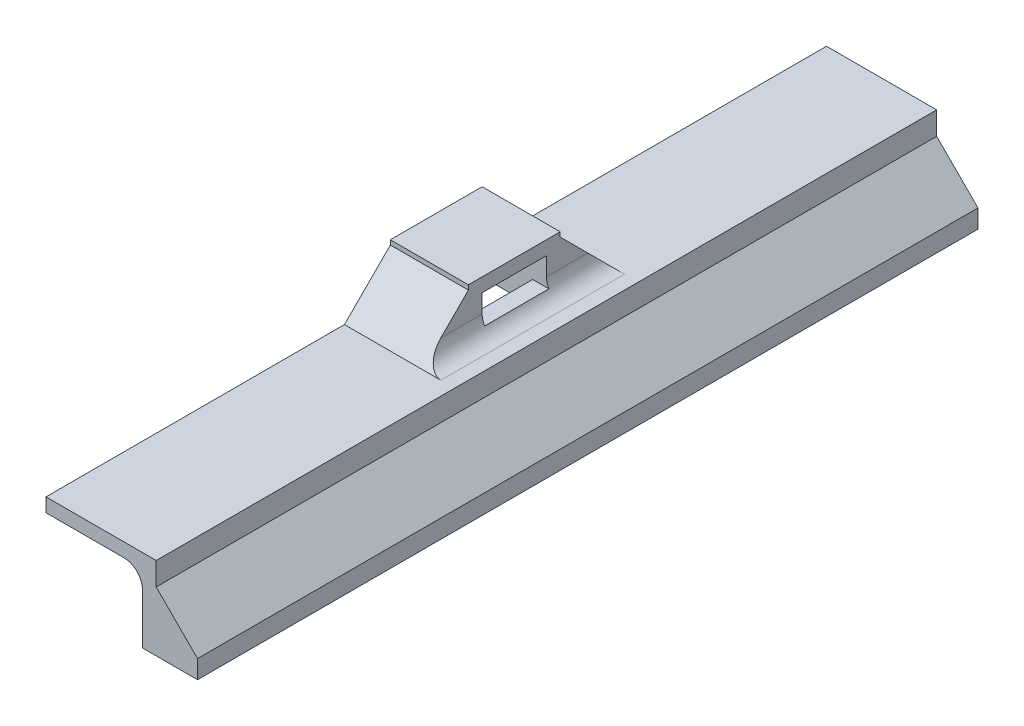
ISO-10303-21;
HEADER;
FILE_DESCRIPTION(('STEP AP214'),'2;1');
FILE_NAME('part.step','',(''),(''),'','','');
FILE_SCHEMA(('AUTOMOTIVE_DESIGN { 1 0 10303 214 1 1 1 1 }'));
ENDSEC;
DATA;
#1=APPLICATION_CONTEXT('core data for automotive mechanical design processes');
#2=APPLICATION_PROTOCOL_DEFINITION('international standard','automotive_design',2000,#1);
#3=PRODUCT_CONTEXT('',#1,'mechanical');
#4=PRODUCT('Part','Part','',(#3));
#5=PRODUCT_RELATED_PRODUCT_CATEGORY('part','',(#4));
#6=PRODUCT_DEFINITION_FORMATION('','',#4);
#7=PRODUCT_DEFINITION_CONTEXT('part definition',#1,'design');
#8=PRODUCT_DEFINITION('design','',#6,#7);
#9=PRODUCT_DEFINITION_SHAPE('','',#8);
#10=(LENGTH_UNIT() NAMED_UNIT(*) SI_UNIT(.MILLI.,.METRE.));
#11=(NAMED_UNIT(*) PLANE_ANGLE_UNIT() SI_UNIT($,.RADIAN.));
#12=(NAMED_UNIT(*) SI_UNIT($,.STERADIAN.) SOLID_ANGLE_UNIT());
#13=UNCERTAINTY_MEASURE_WITH_UNIT(LENGTH_MEASURE(1.E-05),#10,'distance_accuracy_value','');
#14=(GEOMETRIC_REPRESENTATION_CONTEXT(3) GLOBAL_UNCERTAINTY_ASSIGNED_CONTEXT((#13)) GLOBAL_UNIT_ASSIGNED_CONTEXT((#10,
#11,#12)) REPRESENTATION_CONTEXT('',''));
#15=CARTESIAN_POINT('',(0.,0.,0.));
#16=DIRECTION('',(0.,0.,1.));
#17=DIRECTION('',(1.,0.,0.));
#18=AXIS2_PLACEMENT_3D('',#15,#16,#17);
#19=CARTESIAN_POINT('',(-3.,1.5,42.5));
#20=DIRECTION('',(1.,0.,0.));
#21=DIRECTION('',(0.,0.,-1.));
#22=AXIS2_PLACEMENT_3D('',#19,#20,#21);
#23=PLANE('',#22);
#24=DIRECTION('',(0.,-1.,0.));
#25=VECTOR('',#24,1.);
#26=CARTESIAN_POINT('',(-3.,1.5,42.5));
#27=LINE('',#26,#25);
#28=CARTESIAN_POINT('',(-3.,5.5,42.5));
#29=VERTEX_POINT('',#28);
#30=CARTESIAN_POINT('',(-3.,0.,42.5));
#31=VERTEX_POINT('',#30);
#32=EDGE_CURVE('E290',#29,#31,#27,.T.);
#33=ORIENTED_EDGE('',*,*,#32,.F.);
#34=DIRECTION('',(0.,0.,1.));
#35=VECTOR('',#34,1.);
#36=CARTESIAN_POINT('',(-3.,5.5,-42.5));
#37=LINE('',#36,#35);
#38=CARTESIAN_POINT('',(-3.,5.5,-42.5));
#39=VERTEX_POINT('',#38);
#40=EDGE_CURVE('E52',#29,#39,#37,.F.);
#41=ORIENTED_EDGE('',*,*,#40,.T.);
#42=DIRECTION('',(0.,-1.,0.));
#43=VECTOR('',#42,1.);
#44=CARTESIAN_POINT('',(-3.,1.5,-42.5));
#45=LINE('',#44,#43);
#46=CARTESIAN_POINT('',(-3.,0.,-42.5));
#47=VERTEX_POINT('',#46);
#48=EDGE_CURVE('E372',#39,#47,#45,.T.);
#49=ORIENTED_EDGE('',*,*,#48,.T.);
#50=DIRECTION('',(0.,0.,1.));
#51=VECTOR('',#50,1.);
#52=CARTESIAN_POINT('',(-3.,0.,42.5));
#53=LINE('',#52,#51);
#54=EDGE_CURVE('E361',#47,#31,#53,.T.);
#55=ORIENTED_EDGE('',*,*,#54,.T.);
#56=EDGE_LOOP('',(#33,#41,#49,#55));
#57=FACE_BOUND('',#56,.T.);
#58=ADVANCED_FACE('F37',(#57),#23,.F.);
#59=CARTESIAN_POINT('',(3.,1.5,42.5));
#60=DIRECTION('',(0.,0.,-1.));
#61=DIRECTION('',(-1.,0.,0.));
#62=AXIS2_PLACEMENT_3D('',#59,#60,#61);
#63=PLANE('',#62);
#64=DIRECTION('',(1.,0.,0.));
#65=VECTOR('',#64,1.);
#66=CARTESIAN_POINT('',(3.,0.,42.5));
#67=LINE('',#66,#65);
#68=CARTESIAN_POINT('',(3.,0.,42.5));
#69=VERTEX_POINT('',#68);
#70=EDGE_CURVE('E364',#31,#69,#67,.T.);
#71=ORIENTED_EDGE('',*,*,#70,.T.);
#72=DIRECTION('',(0.,-1.,0.));
#73=VECTOR('',#72,1.);
#74=CARTESIAN_POINT('',(3.,1.5,42.5));
#75=LINE('',#74,#73);
#76=CARTESIAN_POINT('',(3.,2.00000000000004,42.5));
#77=VERTEX_POINT('',#76);
#78=EDGE_CURVE('E376',#77,#69,#75,.T.);
#79=ORIENTED_EDGE('',*,*,#78,.F.);
#80=DIRECTION('',(-0.707106781186544,0.707106781186551,0.));
#81=VECTOR('',#80,1.);
#82=CARTESIAN_POINT('',(3.25000000000002,1.75000000000002,42.5));
#83=LINE('',#82,#81);
#84=CARTESIAN_POINT('',(-1.5,6.50000000000009,42.5));
#85=VERTEX_POINT('',#84);
#86=EDGE_CURVE('E296',#77,#85,#83,.T.);
#87=ORIENTED_EDGE('',*,*,#86,.T.);
#88=DIRECTION('',(0.,-1.,0.));
#89=VECTOR('',#88,1.);
#90=CARTESIAN_POINT('',(-1.5,7.5,42.5));
#91=LINE('',#90,#89);
#92=CARTESIAN_POINT('',(-1.5,9.,42.5));
#93=VERTEX_POINT('',#92);
#94=EDGE_CURVE('E365',#93,#85,#91,.T.);
#95=ORIENTED_EDGE('',*,*,#94,.F.);
#96=DIRECTION('',(1.,0.,0.));
#97=VECTOR('',#96,1.);
#98=CARTESIAN_POINT('',(-1.5,9.,42.5));
#99=LINE('',#98,#97);
#100=CARTESIAN_POINT('',(-13.5,9.,42.5));
#101=VERTEX_POINT('',#100);
#102=EDGE_CURVE('E303',#101,#93,#99,.T.);
#103=ORIENTED_EDGE('',*,*,#102,.F.);
#104=DIRECTION('',(0.,-1.,0.));
#105=VECTOR('',#104,1.);
#106=CARTESIAN_POINT('',(-13.5,9.,42.5));
#107=LINE('',#106,#105);
#108=CARTESIAN_POINT('',(-13.5,7.5,42.5));
#109=VERTEX_POINT('',#108);
#110=EDGE_CURVE('E279',#101,#109,#107,.T.);
#111=ORIENTED_EDGE('',*,*,#110,.T.);
#112=DIRECTION('',(1.,0.,0.));
#113=VECTOR('',#112,1.);
#114=CARTESIAN_POINT('',(-1.5,7.5,42.5));
#115=LINE('',#114,#113);
#116=CARTESIAN_POINT('',(-5.,7.5,42.5));
#117=VERTEX_POINT('',#116);
#118=EDGE_CURVE('E251',#109,#117,#115,.T.);
#119=ORIENTED_EDGE('',*,*,#118,.T.);
#120=CARTESIAN_POINT('',(-5.,5.5,42.5));
#121=DIRECTION('',(0.,0.,-1.));
#122=DIRECTION('',(-1.,0.,0.));
#123=AXIS2_PLACEMENT_3D('',#120,#121,#122);
#124=CIRCLE('',#123,2.);
#125=EDGE_CURVE('E45',#117,#29,#124,.T.);
#126=ORIENTED_EDGE('',*,*,#125,.T.);
#127=ORIENTED_EDGE('',*,*,#32,.T.);
#128=EDGE_LOOP('',(#71,#79,#87,#95,#103,#111,#119,#126,#127));
#129=FACE_BOUND('',#128,.T.);
#130=ADVANCED_FACE('F401',(#129),#63,.F.);
#131=CARTESIAN_POINT('',(3.,1.5,42.5));
#132=DIRECTION('',(-1.,0.,0.));
#133=DIRECTION('',(0.,0.,1.));
#134=AXIS2_PLACEMENT_3D('',#131,#132,#133);
#135=PLANE('',#134);
#136=DIRECTION('',(0.,0.,-1.));
#137=VECTOR('',#136,1.);
#138=CARTESIAN_POINT('',(3.,0.,42.5));
#139=LINE('',#138,#137);
#140=CARTESIAN_POINT('',(3.,0.,-42.5));
#141=VERTEX_POINT('',#140);
#142=EDGE_CURVE('E367',#69,#141,#139,.T.);
#143=ORIENTED_EDGE('',*,*,#142,.T.);
#144=DIRECTION('',(0.,-1.,0.));
#145=VECTOR('',#144,1.);
#146=CARTESIAN_POINT('',(3.,1.5,-42.5));
#147=LINE('',#146,#145);
#148=CARTESIAN_POINT('',(3.,2.00000000000004,-42.5));
#149=VERTEX_POINT('',#148);
#150=EDGE_CURVE('E373',#149,#141,#147,.T.);
#151=ORIENTED_EDGE('',*,*,#150,.F.);
#152=DIRECTION('',(0.,0.,1.));
#153=VECTOR('',#152,1.);
#154=CARTESIAN_POINT('',(3.,2.00000000000004,42.5));
#155=LINE('',#154,#153);
#156=EDGE_CURVE('E293',#149,#77,#155,.T.);
#157=ORIENTED_EDGE('',*,*,#156,.T.);
#158=ORIENTED_EDGE('',*,*,#78,.T.);
#159=EDGE_LOOP('',(#143,#151,#157,#158));
#160=FACE_BOUND('',#159,.T.);
#161=ADVANCED_FACE('F462',(#160),#135,.F.);
#162=CARTESIAN_POINT('',(3.,1.5,-42.5));
#163=DIRECTION('',(0.,0.,1.));
#164=DIRECTION('',(1.,0.,0.));
#165=AXIS2_PLACEMENT_3D('',#162,#163,#164);
#166=PLANE('',#165);
#167=DIRECTION('',(-1.,0.,0.));
#168=VECTOR('',#167,1.);
#169=CARTESIAN_POINT('',(3.,0.,-42.5));
#170=LINE('',#169,#168);
#171=EDGE_CURVE('E369',#141,#47,#170,.T.);
#172=ORIENTED_EDGE('',*,*,#171,.T.);
#173=ORIENTED_EDGE('',*,*,#48,.F.);
#174=CARTESIAN_POINT('',(-5.,5.5,-42.5));
#175=DIRECTION('',(0.,0.,1.));
#176=DIRECTION('',(1.,0.,0.));
#177=AXIS2_PLACEMENT_3D('',#174,#175,#176);
#178=CIRCLE('',#177,2.);
#179=CARTESIAN_POINT('',(-5.,7.5,-42.5));
#180=VERTEX_POINT('',#179);
#181=EDGE_CURVE('E11',#39,#180,#178,.T.);
#182=ORIENTED_EDGE('',*,*,#181,.T.);
#183=DIRECTION('',(-1.,0.,0.));
#184=VECTOR('',#183,1.);
#185=CARTESIAN_POINT('',(-1.5,7.5,-42.5));
#186=LINE('',#185,#184);
#187=CARTESIAN_POINT('',(-13.5,7.5,-42.5));
#188=VERTEX_POINT('',#187);
#189=EDGE_CURVE('E245',#180,#188,#186,.T.);
#190=ORIENTED_EDGE('',*,*,#189,.T.);
#191=DIRECTION('',(0.,-1.,0.));
#192=VECTOR('',#191,1.);
#193=CARTESIAN_POINT('',(-13.5,9.,-42.5));
#194=LINE('',#193,#192);
#195=CARTESIAN_POINT('',(-13.5,9.,-42.5));
#196=VERTEX_POINT('',#195);
#197=EDGE_CURVE('E271',#196,#188,#194,.T.);
#198=ORIENTED_EDGE('',*,*,#197,.F.);
#199=DIRECTION('',(-1.,0.,0.));
#200=VECTOR('',#199,1.);
#201=CARTESIAN_POINT('',(-1.5,9.,-42.5));
#202=LINE('',#201,#200);
#203=CARTESIAN_POINT('',(-1.5,9.,-42.5));
#204=VERTEX_POINT('',#203);
#205=EDGE_CURVE('E250',#204,#196,#202,.T.);
#206=ORIENTED_EDGE('',*,*,#205,.F.);
#207=DIRECTION('',(0.,-1.,0.));
#208=VECTOR('',#207,1.);
#209=CARTESIAN_POINT('',(-1.5,7.5,-42.5));
#210=LINE('',#209,#208);
#211=CARTESIAN_POINT('',(-1.5,6.50000000000009,-42.5));
#212=VERTEX_POINT('',#211);
#213=EDGE_CURVE('E379',#204,#212,#210,.T.);
#214=ORIENTED_EDGE('',*,*,#213,.T.);
#215=DIRECTION('',(0.707106781186544,-0.707106781186551,0.));
#216=VECTOR('',#215,1.);
#217=CARTESIAN_POINT('',(3.25000000000002,1.75000000000002,-42.5));
#218=LINE('',#217,#216);
#219=EDGE_CURVE('E289',#212,#149,#218,.T.);
#220=ORIENTED_EDGE('',*,*,#219,.T.);
#221=ORIENTED_EDGE('',*,*,#150,.T.);
#222=EDGE_LOOP('',(#172,#173,#182,#190,#198,#206,#214,#220,#221));
#223=FACE_BOUND('',#222,.T.);
#224=ADVANCED_FACE('F416',(#223),#166,.F.);
#225=CARTESIAN_POINT('',(0.,0.,0.));
#226=DIRECTION('',(0.,1.,0.));
#227=DIRECTION('',(0.,0.,1.));
#228=AXIS2_PLACEMENT_3D('',#225,#226,#227);
#229=PLANE('',#228);
#230=ORIENTED_EDGE('',*,*,#54,.F.);
#231=ORIENTED_EDGE('',*,*,#171,.F.);
#232=ORIENTED_EDGE('',*,*,#142,.F.);
#233=ORIENTED_EDGE('',*,*,#70,.F.);
#234=EDGE_LOOP('',(#230,#231,#232,#233));
#235=FACE_BOUND('',#234,.T.);
#236=ADVANCED_FACE('F484',(#235),#229,.F.);
#237=CARTESIAN_POINT('',(-1.5,7.5,42.5));
#238=DIRECTION('',(-1.,0.,0.));
#239=DIRECTION('',(0.,0.,1.));
#240=AXIS2_PLACEMENT_3D('',#237,#238,#239);
#241=PLANE('',#240);
#242=ORIENTED_EDGE('',*,*,#94,.T.);
#243=DIRECTION('',(0.,0.,-1.));
#244=VECTOR('',#243,1.);
#245=CARTESIAN_POINT('',(-1.5,6.50000000000009,42.5));
#246=LINE('',#245,#244);
#247=EDGE_CURVE('E286',#85,#212,#246,.T.);
#248=ORIENTED_EDGE('',*,*,#247,.T.);
#249=ORIENTED_EDGE('',*,*,#213,.F.);
#250=DIRECTION('',(0.,0.,-1.));
#251=VECTOR('',#250,1.);
#252=CARTESIAN_POINT('',(-1.5,9.,42.5));
#253=LINE('',#252,#251);
#254=EDGE_CURVE('E247',#93,#204,#253,.T.);
#255=ORIENTED_EDGE('',*,*,#254,.F.);
#256=EDGE_LOOP('',(#242,#248,#249,#255));
#257=FACE_BOUND('',#256,.T.);
#258=ADVANCED_FACE('F411',(#257),#241,.F.);
#259=CARTESIAN_POINT('',(0.,7.5,0.));
#260=DIRECTION('',(0.,1.,0.));
#261=DIRECTION('',(0.,0.,1.));
#262=AXIS2_PLACEMENT_3D('',#259,#260,#261);
#263=PLANE('',#262);
#264=ORIENTED_EDGE('',*,*,#189,.F.);
#265=DIRECTION('',(0.,0.,1.));
#266=VECTOR('',#265,1.);
#267=CARTESIAN_POINT('',(-5.,7.5,42.5));
#268=LINE('',#267,#266);
#269=EDGE_CURVE('E336',#180,#117,#268,.T.);
#270=ORIENTED_EDGE('',*,*,#269,.T.);
#271=ORIENTED_EDGE('',*,*,#118,.F.);
#272=DIRECTION('',(0.,0.,1.));
#273=VECTOR('',#272,1.);
#274=CARTESIAN_POINT('',(-13.5,7.5,42.5));
#275=LINE('',#274,#273);
#276=CARTESIAN_POINT('',(-13.5,7.5,3.50000000000001));
#277=VERTEX_POINT('',#276);
#278=EDGE_CURVE('E352',#277,#109,#275,.T.);
#279=ORIENTED_EDGE('',*,*,#278,.F.);
#280=DIRECTION('',(-1.,0.,0.));
#281=VECTOR('',#280,1.);
#282=CARTESIAN_POINT('',(-13.5,7.5,3.50000000000001));
#283=LINE('',#282,#281);
#284=CARTESIAN_POINT('',(-6.50000000000001,7.5,3.50000000000001));
#285=VERTEX_POINT('',#284);
#286=EDGE_CURVE('E350',#285,#277,#283,.T.);
#287=ORIENTED_EDGE('',*,*,#286,.F.);
#288=DIRECTION('',(0.,0.,1.));
#289=VECTOR('',#288,1.);
#290=CARTESIAN_POINT('',(-6.50000000000001,7.5,-3.49999999999999));
#291=LINE('',#290,#289);
#292=CARTESIAN_POINT('',(-6.50000000000001,7.5,-3.49999999999999));
#293=VERTEX_POINT('',#292);
#294=EDGE_CURVE('E347',#293,#285,#291,.T.);
#295=ORIENTED_EDGE('',*,*,#294,.F.);
#296=DIRECTION('',(1.,0.,0.));
#297=VECTOR('',#296,1.);
#298=CARTESIAN_POINT('',(-13.5,7.5,-3.49999999999999));
#299=LINE('',#298,#297);
#300=CARTESIAN_POINT('',(-13.5,7.5,-3.49999999999999));
#301=VERTEX_POINT('',#300);
#302=EDGE_CURVE('E344',#301,#293,#299,.T.);
#303=ORIENTED_EDGE('',*,*,#302,.F.);
#304=DIRECTION('',(0.,0.,1.));
#305=VECTOR('',#304,1.);
#306=CARTESIAN_POINT('',(-13.5,7.5,-3.49999999999999));
#307=LINE('',#306,#305);
#308=EDGE_CURVE('E339',#188,#301,#307,.T.);
#309=ORIENTED_EDGE('',*,*,#308,.F.);
#310=EDGE_LOOP('',(#264,#270,#271,#279,#287,#295,#303,#309));
#311=FACE_BOUND('',#310,.T.);
#312=ADVANCED_FACE('F395',(#311),#263,.F.);
#313=CARTESIAN_POINT('',(-13.5,9.,-3.49999999999999));
#314=DIRECTION('',(1.,0.,0.));
#315=DIRECTION('',(0.,0.,-1.));
#316=AXIS2_PLACEMENT_3D('',#313,#314,#315);
#317=PLANE('',#316);
#318=DIRECTION('',(0.,0.,-1.));
#319=VECTOR('',#318,1.);
#320=CARTESIAN_POINT('',(-13.5,13.,3.50000000000001));
#321=LINE('',#320,#319);
#322=CARTESIAN_POINT('',(-13.5,13.,3.50000000000001));
#323=VERTEX_POINT('',#322);
#324=CARTESIAN_POINT('',(-13.5,13.,-3.49999999999999));
#325=VERTEX_POINT('',#324);
#326=EDGE_CURVE('E210',#323,#325,#321,.T.);
#327=ORIENTED_EDGE('',*,*,#326,.F.);
#328=DIRECTION('',(0.,-1.,0.));
#329=VECTOR('',#328,1.);
#330=CARTESIAN_POINT('',(-13.5,9.,3.50000000000001));
#331=LINE('',#330,#329);
#332=EDGE_CURVE('E275',#323,#277,#331,.T.);
#333=ORIENTED_EDGE('',*,*,#332,.T.);
#334=ORIENTED_EDGE('',*,*,#278,.T.);
#335=ORIENTED_EDGE('',*,*,#110,.F.);
#336=DIRECTION('',(0.,0.,1.));
#337=VECTOR('',#336,1.);
#338=CARTESIAN_POINT('',(-13.5,9.,42.5));
#339=LINE('',#338,#337);
#340=CARTESIAN_POINT('',(-13.5,9.,9.99999999999998));
#341=VERTEX_POINT('',#340);
#342=EDGE_CURVE('E262',#341,#101,#339,.T.);
#343=ORIENTED_EDGE('',*,*,#342,.F.);
#344=DIRECTION('',(0.,0.707106781186551,-0.707106781186544));
#345=VECTOR('',#344,1.);
#346=CARTESIAN_POINT('',(-13.5,15.75,3.25000000000006));
#347=LINE('',#346,#345);
#348=CARTESIAN_POINT('',(-13.5,14.,5.));
#349=VERTEX_POINT('',#348);
#350=EDGE_CURVE('E311',#341,#349,#347,.T.);
#351=ORIENTED_EDGE('',*,*,#350,.T.);
#352=DIRECTION('',(0.,-1.,0.));
#353=VECTOR('',#352,1.);
#354=CARTESIAN_POINT('',(-13.5,14.5,5.));
#355=LINE('',#354,#353);
#356=CARTESIAN_POINT('',(-13.5,14.5,5.));
#357=VERTEX_POINT('',#356);
#358=EDGE_CURVE('E241',#357,#349,#355,.T.);
#359=ORIENTED_EDGE('',*,*,#358,.F.);
#360=DIRECTION('',(0.,0.,1.));
#361=VECTOR('',#360,1.);
#362=CARTESIAN_POINT('',(-13.5,14.5,0.));
#363=LINE('',#362,#361);
#364=CARTESIAN_POINT('',(-13.5,14.5,-5.));
#365=VERTEX_POINT('',#364);
#366=EDGE_CURVE('E234',#365,#357,#363,.T.);
#367=ORIENTED_EDGE('',*,*,#366,.F.);
#368=DIRECTION('',(0.,-1.,0.));
#369=VECTOR('',#368,1.);
#370=CARTESIAN_POINT('',(-13.5,14.5,-5.));
#371=LINE('',#370,#369);
#372=CARTESIAN_POINT('',(-13.5,14.,-5.));
#373=VERTEX_POINT('',#372);
#374=EDGE_CURVE('E246',#365,#373,#371,.T.);
#375=ORIENTED_EDGE('',*,*,#374,.T.);
#376=DIRECTION('',(0.,0.707106781186544,0.707106781186551));
#377=VECTOR('',#376,1.);
#378=CARTESIAN_POINT('',(-13.5,12.25,-6.74999999999998));
#379=LINE('',#378,#377);
#380=CARTESIAN_POINT('',(-13.5,9.,-10.));
#381=VERTEX_POINT('',#380);
#382=EDGE_CURVE('E315',#373,#381,#379,.F.);
#383=ORIENTED_EDGE('',*,*,#382,.T.);
#384=DIRECTION('',(0.,0.,1.));
#385=VECTOR('',#384,1.);
#386=CARTESIAN_POINT('',(-13.5,9.,-3.49999999999999));
#387=LINE('',#386,#385);
#388=EDGE_CURVE('E253',#196,#381,#387,.T.);
#389=ORIENTED_EDGE('',*,*,#388,.F.);
#390=ORIENTED_EDGE('',*,*,#197,.T.);
#391=ORIENTED_EDGE('',*,*,#308,.T.);
#392=DIRECTION('',(0.,-1.,0.));
#393=VECTOR('',#392,1.);
#394=CARTESIAN_POINT('',(-13.5,9.,-3.49999999999999));
#395=LINE('',#394,#393);
#396=EDGE_CURVE('E269',#325,#301,#395,.T.);
#397=ORIENTED_EDGE('',*,*,#396,.F.);
#398=EDGE_LOOP('',(#327,#333,#334,#335,#343,#351,#359,#367,#375,#383,#389,#390,#391,#397));
#399=FACE_BOUND('',#398,.T.);
#400=ADVANCED_FACE('F434',(#399),#317,.F.);
#401=CARTESIAN_POINT('',(-13.5,9.,-3.49999999999999));
#402=DIRECTION('',(0.,0.,-1.));
#403=DIRECTION('',(-1.,0.,0.));
#404=AXIS2_PLACEMENT_3D('',#401,#402,#403);
#405=PLANE('',#404);
#406=DIRECTION('',(0.,-1.,0.));
#407=VECTOR('',#406,1.);
#408=CARTESIAN_POINT('',(-6.50000000000001,9.,-3.49999999999999));
#409=LINE('',#408,#407);
#410=CARTESIAN_POINT('',(-6.50000000000001,10.,-3.49999999999999));
#411=VERTEX_POINT('',#410);
#412=EDGE_CURVE('E272',#411,#293,#409,.T.);
#413=ORIENTED_EDGE('',*,*,#412,.F.);
#414=DIRECTION('',(1.,0.,0.));
#415=VECTOR('',#414,1.);
#416=CARTESIAN_POINT('',(-9.00000000000001,10.,-3.5));
#417=LINE('',#416,#415);
#418=CARTESIAN_POINT('',(-4.73205080756889,10.,-3.5));
#419=VERTEX_POINT('',#418);
#420=EDGE_CURVE('E218',#411,#419,#417,.T.);
#421=ORIENTED_EDGE('',*,*,#420,.T.);
#422=CARTESIAN_POINT('',(-3.00000000000001,11.,-3.49999999999999));
#423=DIRECTION('',(0.,0.,-1.));
#424=DIRECTION('',(-1.,0.,0.));
#425=AXIS2_PLACEMENT_3D('',#422,#423,#424);
#426=CIRCLE('',#425,2.);
#427=CARTESIAN_POINT('',(-5.00000000000001,11.,-3.5));
#428=VERTEX_POINT('',#427);
#429=EDGE_CURVE('E198',#419,#428,#426,.T.);
#430=ORIENTED_EDGE('',*,*,#429,.T.);
#431=DIRECTION('',(0.,1.,0.));
#432=VECTOR('',#431,1.);
#433=CARTESIAN_POINT('',(-5.00000000000001,10.,-3.5));
#434=LINE('',#433,#432);
#435=CARTESIAN_POINT('',(-5.00000000000001,13.,-3.5));
#436=VERTEX_POINT('',#435);
#437=EDGE_CURVE('E190',#428,#436,#434,.T.);
#438=ORIENTED_EDGE('',*,*,#437,.T.);
#439=DIRECTION('',(1.,0.,0.));
#440=VECTOR('',#439,1.);
#441=CARTESIAN_POINT('',(-13.5,13.,-3.49999999999999));
#442=LINE('',#441,#440);
#443=EDGE_CURVE('E195',#325,#436,#442,.T.);
#444=ORIENTED_EDGE('',*,*,#443,.F.);
#445=ORIENTED_EDGE('',*,*,#396,.T.);
#446=ORIENTED_EDGE('',*,*,#302,.T.);
#447=EDGE_LOOP('',(#413,#421,#430,#438,#444,#445,#446));
#448=FACE_BOUND('',#447,.T.);
#449=ADVANCED_FACE('F193',(#448),#405,.F.);
#450=CARTESIAN_POINT('',(-6.50000000000001,9.,-3.49999999999999));
#451=DIRECTION('',(1.,0.,0.));
#452=DIRECTION('',(0.,0.,-1.));
#453=AXIS2_PLACEMENT_3D('',#450,#451,#452);
#454=PLANE('',#453);
#455=DIRECTION('',(0.,-1.,0.));
#456=VECTOR('',#455,1.);
#457=CARTESIAN_POINT('',(-6.50000000000001,9.,3.50000000000001));
#458=LINE('',#457,#456);
#459=CARTESIAN_POINT('',(-6.50000000000001,10.,3.5));
#460=VERTEX_POINT('',#459);
#461=EDGE_CURVE('E278',#460,#285,#458,.T.);
#462=ORIENTED_EDGE('',*,*,#461,.F.);
#463=DIRECTION('',(0.,0.,-1.));
#464=VECTOR('',#463,1.);
#465=CARTESIAN_POINT('',(-6.50000000000001,10.,-3.49999999999999));
#466=LINE('',#465,#464);
#467=EDGE_CURVE('E222',#460,#411,#466,.T.);
#468=ORIENTED_EDGE('',*,*,#467,.T.);
#469=ORIENTED_EDGE('',*,*,#412,.T.);
#470=ORIENTED_EDGE('',*,*,#294,.T.);
#471=EDGE_LOOP('',(#462,#468,#469,#470));
#472=FACE_BOUND('',#471,.T.);
#473=ADVANCED_FACE('F503',(#472),#454,.F.);
#474=CARTESIAN_POINT('',(-13.5,9.,3.50000000000001));
#475=DIRECTION('',(0.,0.,1.));
#476=DIRECTION('',(1.,0.,0.));
#477=AXIS2_PLACEMENT_3D('',#474,#475,#476);
#478=PLANE('',#477);
#479=DIRECTION('',(-1.,0.,0.));
#480=VECTOR('',#479,1.);
#481=CARTESIAN_POINT('',(-13.5,13.,3.50000000000001));
#482=LINE('',#481,#480);
#483=CARTESIAN_POINT('',(-5.00000000000001,13.,3.5));
#484=VERTEX_POINT('',#483);
#485=EDGE_CURVE('E211',#484,#323,#482,.T.);
#486=ORIENTED_EDGE('',*,*,#485,.F.);
#487=DIRECTION('',(0.,-1.,0.));
#488=VECTOR('',#487,1.);
#489=CARTESIAN_POINT('',(-5.00000000000001,10.,3.5));
#490=LINE('',#489,#488);
#491=CARTESIAN_POINT('',(-5.00000000000001,11.,3.5));
#492=VERTEX_POINT('',#491);
#493=EDGE_CURVE('E203',#484,#492,#490,.T.);
#494=ORIENTED_EDGE('',*,*,#493,.T.);
#495=CARTESIAN_POINT('',(-3.00000000000001,11.,3.50000000000001));
#496=DIRECTION('',(0.,0.,1.));
#497=DIRECTION('',(1.,0.,0.));
#498=AXIS2_PLACEMENT_3D('',#495,#496,#497);
#499=CIRCLE('',#498,2.);
#500=CARTESIAN_POINT('',(-4.73205080756889,10.,3.5));
#501=VERTEX_POINT('',#500);
#502=EDGE_CURVE('E326',#492,#501,#499,.T.);
#503=ORIENTED_EDGE('',*,*,#502,.T.);
#504=DIRECTION('',(1.,0.,0.));
#505=VECTOR('',#504,1.);
#506=CARTESIAN_POINT('',(-9.00000000000001,10.,3.5));
#507=LINE('',#506,#505);
#508=EDGE_CURVE('E216',#460,#501,#507,.T.);
#509=ORIENTED_EDGE('',*,*,#508,.F.);
#510=ORIENTED_EDGE('',*,*,#461,.T.);
#511=ORIENTED_EDGE('',*,*,#286,.T.);
#512=ORIENTED_EDGE('',*,*,#332,.F.);
#513=EDGE_LOOP('',(#486,#494,#503,#509,#510,#511,#512));
#514=FACE_BOUND('',#513,.T.);
#515=ADVANCED_FACE('F506',(#514),#478,.F.);
#516=CARTESIAN_POINT('',(0.,9.,0.));
#517=DIRECTION('',(0.,1.,0.));
#518=DIRECTION('',(0.,0.,1.));
#519=AXIS2_PLACEMENT_3D('',#516,#517,#518);
#520=PLANE('',#519);
#521=DIRECTION('',(0.,0.,1.));
#522=VECTOR('',#521,1.);
#523=CARTESIAN_POINT('',(-3.00000000000001,9.,9.99999999999998));
#524=LINE('',#523,#522);
#525=CARTESIAN_POINT('',(-3.00000000000001,9.,-10.));
#526=VERTEX_POINT('',#525);
#527=CARTESIAN_POINT('',(-3.00000000000001,9.,9.99999999999998));
#528=VERTEX_POINT('',#527);
#529=EDGE_CURVE('E317',#526,#528,#524,.T.);
#530=ORIENTED_EDGE('',*,*,#529,.T.);
#531=DIRECTION('',(-1.,0.,0.));
#532=VECTOR('',#531,1.);
#533=CARTESIAN_POINT('',(0.,9.,9.99999999999998));
#534=LINE('',#533,#532);
#535=EDGE_CURVE('E305',#528,#341,#534,.T.);
#536=ORIENTED_EDGE('',*,*,#535,.T.);
#537=ORIENTED_EDGE('',*,*,#342,.T.);
#538=ORIENTED_EDGE('',*,*,#102,.T.);
#539=ORIENTED_EDGE('',*,*,#254,.T.);
#540=ORIENTED_EDGE('',*,*,#205,.T.);
#541=ORIENTED_EDGE('',*,*,#388,.T.);
#542=DIRECTION('',(1.,0.,0.));
#543=VECTOR('',#542,1.);
#544=CARTESIAN_POINT('',(-5.00000000000001,9.,-10.));
#545=LINE('',#544,#543);
#546=EDGE_CURVE('E301',#381,#526,#545,.T.);
#547=ORIENTED_EDGE('',*,*,#546,.T.);
#548=EDGE_LOOP('',(#530,#536,#537,#538,#539,#540,#541,#547));
#549=FACE_BOUND('',#548,.T.);
#550=ADVANCED_FACE('F409',(#549),#520,.T.);
#551=CARTESIAN_POINT('',(-5.00000000000001,14.5,0.));
#552=DIRECTION('',(1.,0.,0.));
#553=DIRECTION('',(0.,0.,-1.));
#554=AXIS2_PLACEMENT_3D('',#551,#552,#553);
#555=PLANE('',#554);
#556=DIRECTION('',(0.,-0.707106781186551,0.707106781186544));
#557=VECTOR('',#556,1.);
#558=CARTESIAN_POINT('',(-5.00000000000001,14.,5.));
#559=LINE('',#558,#557);
#560=CARTESIAN_POINT('',(-5.00000000000001,14.,5.));
#561=VERTEX_POINT('',#560);
#562=CARTESIAN_POINT('',(-5.00000000000001,11.,8.));
#563=VERTEX_POINT('',#562);
#564=EDGE_CURVE('E309',#561,#563,#559,.T.);
#565=ORIENTED_EDGE('',*,*,#564,.T.);
#566=DIRECTION('',(0.,0.,1.));
#567=VECTOR('',#566,1.);
#568=CARTESIAN_POINT('',(-5.00000000000001,11.,-10.));
#569=LINE('',#568,#567);
#570=EDGE_CURVE('E322',#563,#492,#569,.F.);
#571=ORIENTED_EDGE('',*,*,#570,.T.);
#572=ORIENTED_EDGE('',*,*,#493,.F.);
#573=DIRECTION('',(0.,0.,1.));
#574=VECTOR('',#573,1.);
#575=CARTESIAN_POINT('',(-5.00000000000001,13.,3.5));
#576=LINE('',#575,#574);
#577=EDGE_CURVE('E202',#436,#484,#576,.T.);
#578=ORIENTED_EDGE('',*,*,#577,.F.);
#579=ORIENTED_EDGE('',*,*,#437,.F.);
#580=DIRECTION('',(0.,0.,1.));
#581=VECTOR('',#580,1.);
#582=CARTESIAN_POINT('',(-5.00000000000001,11.,-10.));
#583=LINE('',#582,#581);
#584=CARTESIAN_POINT('',(-5.00000000000001,11.,-8.00000000000002));
#585=VERTEX_POINT('',#584);
#586=EDGE_CURVE('E320',#428,#585,#583,.F.);
#587=ORIENTED_EDGE('',*,*,#586,.T.);
#588=DIRECTION('',(0.,-0.707106781186544,-0.707106781186551));
#589=VECTOR('',#588,1.);
#590=CARTESIAN_POINT('',(-5.00000000000001,9.,-10.));
#591=LINE('',#590,#589);
#592=CARTESIAN_POINT('',(-5.00000000000001,14.,-5.));
#593=VERTEX_POINT('',#592);
#594=EDGE_CURVE('E313',#585,#593,#591,.F.);
#595=ORIENTED_EDGE('',*,*,#594,.T.);
#596=DIRECTION('',(0.,-1.,0.));
#597=VECTOR('',#596,1.);
#598=CARTESIAN_POINT('',(-5.00000000000001,14.5,-5.));
#599=LINE('',#598,#597);
#600=CARTESIAN_POINT('',(-5.00000000000001,14.5,-5.));
#601=VERTEX_POINT('',#600);
#602=EDGE_CURVE('E242',#601,#593,#599,.T.);
#603=ORIENTED_EDGE('',*,*,#602,.F.);
#604=DIRECTION('',(0.,0.,1.));
#605=VECTOR('',#604,1.);
#606=CARTESIAN_POINT('',(-5.00000000000001,14.5,0.));
#607=LINE('',#606,#605);
#608=CARTESIAN_POINT('',(-5.00000000000001,14.5,5.));
#609=VERTEX_POINT('',#608);
#610=EDGE_CURVE('E228',#601,#609,#607,.T.);
#611=ORIENTED_EDGE('',*,*,#610,.T.);
#612=DIRECTION('',(0.,-1.,0.));
#613=VECTOR('',#612,1.);
#614=CARTESIAN_POINT('',(-5.00000000000001,14.5,5.));
#615=LINE('',#614,#613);
#616=EDGE_CURVE('E238',#609,#561,#615,.T.);
#617=ORIENTED_EDGE('',*,*,#616,.T.);
#618=EDGE_LOOP('',(#565,#571,#572,#578,#579,#587,#595,#603,#611,#617));
#619=FACE_BOUND('',#618,.T.);
#620=ADVANCED_FACE('F214',(#619),#555,.T.);
#621=CARTESIAN_POINT('',(0.,14.5,-5.));
#622=DIRECTION('',(0.,0.,-1.));
#623=DIRECTION('',(-1.,0.,0.));
#624=AXIS2_PLACEMENT_3D('',#621,#622,#623);
#625=PLANE('',#624);
#626=ORIENTED_EDGE('',*,*,#602,.T.);
#627=DIRECTION('',(-1.,0.,0.));
#628=VECTOR('',#627,1.);
#629=CARTESIAN_POINT('',(-13.5,14.,-5.));
#630=LINE('',#629,#628);
#631=EDGE_CURVE('E307',#593,#373,#630,.T.);
#632=ORIENTED_EDGE('',*,*,#631,.T.);
#633=ORIENTED_EDGE('',*,*,#374,.F.);
#634=DIRECTION('',(1.,0.,0.));
#635=VECTOR('',#634,1.);
#636=CARTESIAN_POINT('',(0.,14.5,-5.));
#637=LINE('',#636,#635);
#638=EDGE_CURVE('E231',#365,#601,#637,.T.);
#639=ORIENTED_EDGE('',*,*,#638,.T.);
#640=EDGE_LOOP('',(#626,#632,#633,#639));
#641=FACE_BOUND('',#640,.T.);
#642=ADVANCED_FACE('F447',(#641),#625,.T.);
#643=CARTESIAN_POINT('',(0.,14.5,5.));
#644=DIRECTION('',(0.,0.,-1.));
#645=DIRECTION('',(-1.,0.,0.));
#646=AXIS2_PLACEMENT_3D('',#643,#644,#645);
#647=PLANE('',#646);
#648=ORIENTED_EDGE('',*,*,#358,.T.);
#649=DIRECTION('',(1.,0.,0.));
#650=VECTOR('',#649,1.);
#651=CARTESIAN_POINT('',(0.,14.,5.));
#652=LINE('',#651,#650);
#653=EDGE_CURVE('E298',#349,#561,#652,.T.);
#654=ORIENTED_EDGE('',*,*,#653,.T.);
#655=ORIENTED_EDGE('',*,*,#616,.F.);
#656=DIRECTION('',(1.,0.,0.));
#657=VECTOR('',#656,1.);
#658=CARTESIAN_POINT('',(0.,14.5,5.));
#659=LINE('',#658,#657);
#660=EDGE_CURVE('E236',#357,#609,#659,.T.);
#661=ORIENTED_EDGE('',*,*,#660,.F.);
#662=EDGE_LOOP('',(#648,#654,#655,#661));
#663=FACE_BOUND('',#662,.T.);
#664=ADVANCED_FACE('F440',(#663),#647,.F.);
#665=CARTESIAN_POINT('',(0.,14.5,0.));
#666=DIRECTION('',(0.,1.,0.));
#667=DIRECTION('',(0.,0.,1.));
#668=AXIS2_PLACEMENT_3D('',#665,#666,#667);
#669=PLANE('',#668);
#670=ORIENTED_EDGE('',*,*,#610,.F.);
#671=ORIENTED_EDGE('',*,*,#638,.F.);
#672=ORIENTED_EDGE('',*,*,#366,.T.);
#673=ORIENTED_EDGE('',*,*,#660,.T.);
#674=EDGE_LOOP('',(#670,#671,#672,#673));
#675=FACE_BOUND('',#674,.T.);
#676=ADVANCED_FACE('F445',(#675),#669,.T.);
#677=CARTESIAN_POINT('',(0.,13.,0.));
#678=DIRECTION('',(0.,-1.,0.));
#679=DIRECTION('',(0.,0.,-1.));
#680=AXIS2_PLACEMENT_3D('',#677,#678,#679);
#681=PLANE('',#680);
#682=ORIENTED_EDGE('',*,*,#443,.T.);
#683=ORIENTED_EDGE('',*,*,#577,.T.);
#684=ORIENTED_EDGE('',*,*,#485,.T.);
#685=ORIENTED_EDGE('',*,*,#326,.T.);
#686=EDGE_LOOP('',(#682,#683,#684,#685));
#687=FACE_BOUND('',#686,.T.);
#688=ADVANCED_FACE('F207',(#687),#681,.T.);
#689=CARTESIAN_POINT('',(-9.00000000000001,10.,3.5));
#690=DIRECTION('',(0.,-1.,0.));
#691=DIRECTION('',(0.,0.,-1.));
#692=AXIS2_PLACEMENT_3D('',#689,#690,#691);
#693=PLANE('',#692);
#694=ORIENTED_EDGE('',*,*,#508,.T.);
#695=DIRECTION('',(0.,0.,-1.));
#696=VECTOR('',#695,1.);
#697=CARTESIAN_POINT('',(-4.73205080756889,10.,3.50000000000001));
#698=LINE('',#697,#696);
#699=EDGE_CURVE('E329',#501,#419,#698,.T.);
#700=ORIENTED_EDGE('',*,*,#699,.T.);
#701=ORIENTED_EDGE('',*,*,#420,.F.);
#702=ORIENTED_EDGE('',*,*,#467,.F.);
#703=EDGE_LOOP('',(#694,#700,#701,#702));
#704=FACE_BOUND('',#703,.T.);
#705=ADVANCED_FACE('F469',(#704),#693,.F.);
#706=CARTESIAN_POINT('',(-1.5,6.50000000000009,42.5));
#707=DIRECTION('',(-0.707106781186551,-0.707106781186544,0.));
#708=DIRECTION('',(0.,0.,-1.));
#709=AXIS2_PLACEMENT_3D('',#706,#707,#708);
#710=PLANE('',#709);
#711=ORIENTED_EDGE('',*,*,#86,.F.);
#712=ORIENTED_EDGE('',*,*,#156,.F.);
#713=ORIENTED_EDGE('',*,*,#219,.F.);
#714=ORIENTED_EDGE('',*,*,#247,.F.);
#715=EDGE_LOOP('',(#711,#712,#713,#714));
#716=FACE_BOUND('',#715,.T.);
#717=ADVANCED_FACE('F466',(#716),#710,.F.);
#718=CARTESIAN_POINT('',(0.,14.,5.));
#719=DIRECTION('',(0.,-0.707106781186544,-0.707106781186551));
#720=DIRECTION('',(1.,0.,0.));
#721=AXIS2_PLACEMENT_3D('',#718,#719,#720);
#722=PLANE('',#721);
#723=ORIENTED_EDGE('',*,*,#350,.F.);
#724=ORIENTED_EDGE('',*,*,#535,.F.);
#725=CARTESIAN_POINT('',(-3.00000000000001,11.,8.));
#726=DIRECTION('',(0.,-0.707106781186544,-0.707106781186551));
#727=DIRECTION('',(0.,0.707106781186551,-0.707106781186544));
#728=AXIS2_PLACEMENT_3D('',#725,#726,#727);
#729=ELLIPSE('',#728,2.82842712474618,2.);
#730=EDGE_CURVE('E324',#528,#563,#729,.T.);
#731=ORIENTED_EDGE('',*,*,#730,.T.);
#732=ORIENTED_EDGE('',*,*,#564,.F.);
#733=ORIENTED_EDGE('',*,*,#653,.F.);
#734=EDGE_LOOP('',(#723,#724,#731,#732,#733));
#735=FACE_BOUND('',#734,.T.);
#736=ADVANCED_FACE('F437',(#735),#722,.F.);
#737=CARTESIAN_POINT('',(0.,9.,-10.));
#738=DIRECTION('',(0.,0.707106781186551,-0.707106781186544));
#739=DIRECTION('',(-1.,0.,0.));
#740=AXIS2_PLACEMENT_3D('',#737,#738,#739);
#741=PLANE('',#740);
#742=ORIENTED_EDGE('',*,*,#382,.F.);
#743=ORIENTED_EDGE('',*,*,#631,.F.);
#744=ORIENTED_EDGE('',*,*,#594,.F.);
#745=CARTESIAN_POINT('',(-3.00000000000001,11.,-8.00000000000002));
#746=DIRECTION('',(0.,0.707106781186551,-0.707106781186544));
#747=DIRECTION('',(0.,-0.707106781186544,-0.707106781186551));
#748=AXIS2_PLACEMENT_3D('',#745,#746,#747);
#749=ELLIPSE('',#748,2.8284271247462,2.);
#750=EDGE_CURVE('E333',#585,#526,#749,.F.);
#751=ORIENTED_EDGE('',*,*,#750,.T.);
#752=ORIENTED_EDGE('',*,*,#546,.F.);
#753=EDGE_LOOP('',(#742,#743,#744,#751,#752));
#754=FACE_BOUND('',#753,.T.);
#755=ADVANCED_FACE('F422',(#754),#741,.T.);
#756=CARTESIAN_POINT('',(-3.00000000000001,11.,0.));
#757=DIRECTION('',(0.,0.,-1.));
#758=DIRECTION('',(-1.,0.,0.));
#759=AXIS2_PLACEMENT_3D('',#756,#757,#758);
#760=CYLINDRICAL_SURFACE('',#759,2.);
#761=ORIENTED_EDGE('',*,*,#502,.F.);
#762=ORIENTED_EDGE('',*,*,#570,.F.);
#763=ORIENTED_EDGE('',*,*,#730,.F.);
#764=ORIENTED_EDGE('',*,*,#529,.F.);
#765=ORIENTED_EDGE('',*,*,#750,.F.);
#766=ORIENTED_EDGE('',*,*,#586,.F.);
#767=ORIENTED_EDGE('',*,*,#429,.F.);
#768=ORIENTED_EDGE('',*,*,#699,.F.);
#769=EDGE_LOOP('',(#761,#762,#763,#764,#765,#766,#767,#768));
#770=FACE_BOUND('',#769,.T.);
#771=ADVANCED_FACE('F430',(#770),#760,.F.);
#772=CARTESIAN_POINT('',(-5.,5.5,0.));
#773=DIRECTION('',(0.,0.,-1.));
#774=DIRECTION('',(-1.,0.,0.));
#775=AXIS2_PLACEMENT_3D('',#772,#773,#774);
#776=CYLINDRICAL_SURFACE('',#775,2.);
#777=ORIENTED_EDGE('',*,*,#181,.F.);
#778=ORIENTED_EDGE('',*,*,#40,.F.);
#779=ORIENTED_EDGE('',*,*,#125,.F.);
#780=ORIENTED_EDGE('',*,*,#269,.F.);
#781=EDGE_LOOP('',(#777,#778,#779,#780));
#782=FACE_BOUND('',#781,.T.);
#783=ADVANCED_FACE('F39',(#782),#776,.F.);
#784=CLOSED_SHELL('',(#58,#130,#161,#224,#236,#258,#312,#400,#449,#473,#515,#550,#620,#642,#664,
#676,#688,#705,#717,#736,#755,#771,#783));
#785=MANIFOLD_SOLID_BREP('B2',#784);
#786=ADVANCED_BREP_SHAPE_REPRESENTATION('',(#18,#785),#14);
#787=SHAPE_DEFINITION_REPRESENTATION(#9,#786);
ENDSEC;
END-ISO-10303-21;
